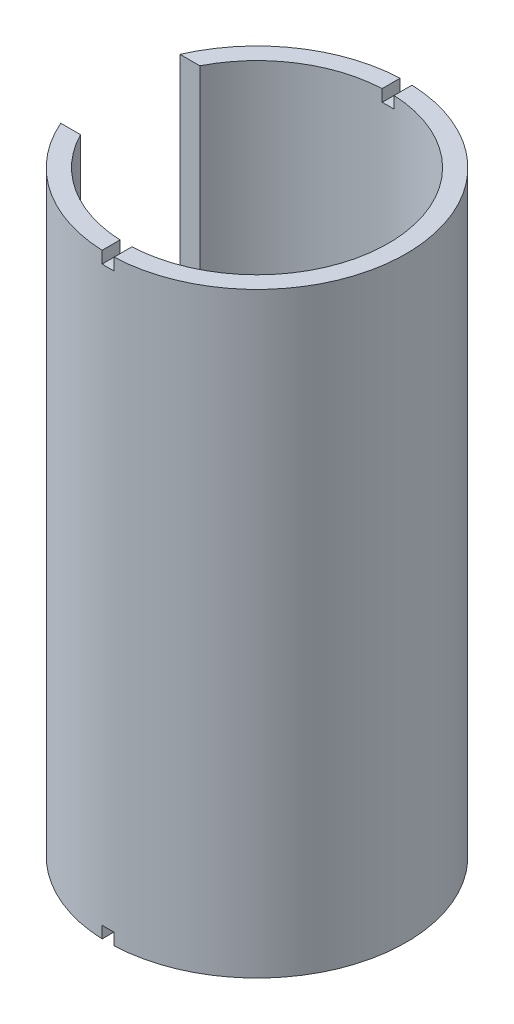
ISO-10303-21;
HEADER;
FILE_DESCRIPTION(('STEP AP214'),'2;1');
FILE_NAME('part.step','',(''),(''),'','','');
FILE_SCHEMA(('AUTOMOTIVE_DESIGN { 1 0 10303 214 1 1 1 1 }'));
ENDSEC;
DATA;
#1=APPLICATION_CONTEXT('core data for automotive mechanical design processes');
#2=APPLICATION_PROTOCOL_DEFINITION('international standard','automotive_design',2000,#1);
#3=PRODUCT_CONTEXT('',#1,'mechanical');
#4=PRODUCT('Part','Part','',(#3));
#5=PRODUCT_RELATED_PRODUCT_CATEGORY('part','',(#4));
#6=PRODUCT_DEFINITION_FORMATION('','',#4);
#7=PRODUCT_DEFINITION_CONTEXT('part definition',#1,'design');
#8=PRODUCT_DEFINITION('design','',#6,#7);
#9=PRODUCT_DEFINITION_SHAPE('','',#8);
#10=(LENGTH_UNIT() NAMED_UNIT(*) SI_UNIT(.MILLI.,.METRE.));
#11=(NAMED_UNIT(*) PLANE_ANGLE_UNIT() SI_UNIT($,.RADIAN.));
#12=(NAMED_UNIT(*) SI_UNIT($,.STERADIAN.) SOLID_ANGLE_UNIT());
#13=UNCERTAINTY_MEASURE_WITH_UNIT(LENGTH_MEASURE(1.E-05),#10,'distance_accuracy_value','');
#14=(GEOMETRIC_REPRESENTATION_CONTEXT(3) GLOBAL_UNCERTAINTY_ASSIGNED_CONTEXT((#13)) GLOBAL_UNIT_ASSIGNED_CONTEXT((#10,
#11,#12)) REPRESENTATION_CONTEXT('',''));
#15=CARTESIAN_POINT('',(0.,0.,0.));
#16=DIRECTION('',(0.,0.,1.));
#17=DIRECTION('',(1.,0.,0.));
#18=AXIS2_PLACEMENT_3D('',#15,#16,#17);
#19=CARTESIAN_POINT('',(0.,100.,0.));
#20=DIRECTION('',(0.,1.,0.));
#21=DIRECTION('',(0.,0.,1.));
#22=AXIS2_PLACEMENT_3D('',#19,#20,#21);
#23=PLANE('',#22);
#24=CARTESIAN_POINT('',(0.,100.,0.));
#25=DIRECTION('',(0.,1.,0.));
#26=DIRECTION('',(0.,0.,1.));
#27=AXIS2_PLACEMENT_3D('',#24,#25,#26);
#28=CIRCLE('',#27,25.);
#29=CARTESIAN_POINT('',(-1.,100.,-24.9799919935936));
#30=VERTEX_POINT('',#29);
#31=CARTESIAN_POINT('',(-22.9128784747792,100.,-10.));
#32=VERTEX_POINT('',#31);
#33=EDGE_CURVE('E181',#30,#32,#28,.T.);
#34=ORIENTED_EDGE('',*,*,#33,.T.);
#35=DIRECTION('',(1.,0.,0.));
#36=VECTOR('',#35,1.);
#37=CARTESIAN_POINT('',(0.,100.,-10.));
#38=LINE('',#37,#36);
#39=CARTESIAN_POINT('',(-19.5959179422654,100.,-10.));
#40=VERTEX_POINT('',#39);
#41=EDGE_CURVE('E167',#32,#40,#38,.T.);
#42=ORIENTED_EDGE('',*,*,#41,.T.);
#43=CARTESIAN_POINT('',(0.,100.,0.));
#44=DIRECTION('',(0.,1.,0.));
#45=DIRECTION('',(0.,0.,1.));
#46=AXIS2_PLACEMENT_3D('',#43,#44,#45);
#47=CIRCLE('',#46,22.);
#48=CARTESIAN_POINT('',(-1.,100.,-21.9772609758359));
#49=VERTEX_POINT('',#48);
#50=EDGE_CURVE('E231',#49,#40,#47,.T.);
#51=ORIENTED_EDGE('',*,*,#50,.F.);
#52=DIRECTION('',(0.,0.,1.));
#53=VECTOR('',#52,1.);
#54=CARTESIAN_POINT('',(-1.,100.,-25.));
#55=LINE('',#54,#53);
#56=EDGE_CURVE('E188',#30,#49,#55,.T.);
#57=ORIENTED_EDGE('',*,*,#56,.F.);
#58=EDGE_LOOP('',(#34,#42,#51,#57));
#59=FACE_BOUND('',#58,.T.);
#60=ADVANCED_FACE('F33',(#59),#23,.T.);
#61=CARTESIAN_POINT('',(0.,0.,0.));
#62=DIRECTION('',(0.,1.,0.));
#63=DIRECTION('',(0.,0.,1.));
#64=AXIS2_PLACEMENT_3D('',#61,#62,#63);
#65=PLANE('',#64);
#66=DIRECTION('',(1.,0.,0.));
#67=VECTOR('',#66,1.);
#68=CARTESIAN_POINT('',(0.,0.,-10.));
#69=LINE('',#68,#67);
#70=CARTESIAN_POINT('',(-22.9128784747792,0.,-10.));
#71=VERTEX_POINT('',#70);
#72=CARTESIAN_POINT('',(-19.5959179422654,0.,-10.));
#73=VERTEX_POINT('',#72);
#74=EDGE_CURVE('E48',#71,#73,#69,.T.);
#75=ORIENTED_EDGE('',*,*,#74,.F.);
#76=CARTESIAN_POINT('',(0.,0.,0.));
#77=DIRECTION('',(0.,1.,0.));
#78=DIRECTION('',(0.,0.,1.));
#79=AXIS2_PLACEMENT_3D('',#76,#77,#78);
#80=CIRCLE('',#79,25.);
#81=CARTESIAN_POINT('',(-1.,0.,-24.9799919935936));
#82=VERTEX_POINT('',#81);
#83=EDGE_CURVE('E184',#82,#71,#80,.T.);
#84=ORIENTED_EDGE('',*,*,#83,.F.);
#85=DIRECTION('',(0.,0.,1.));
#86=VECTOR('',#85,1.);
#87=CARTESIAN_POINT('',(-1.,0.,-25.));
#88=LINE('',#87,#86);
#89=CARTESIAN_POINT('',(-1.,0.,-21.9772609758359));
#90=VERTEX_POINT('',#89);
#91=EDGE_CURVE('E235',#82,#90,#88,.T.);
#92=ORIENTED_EDGE('',*,*,#91,.T.);
#93=CARTESIAN_POINT('',(0.,0.,0.));
#94=DIRECTION('',(0.,1.,0.));
#95=DIRECTION('',(0.,0.,1.));
#96=AXIS2_PLACEMENT_3D('',#93,#94,#95);
#97=CIRCLE('',#96,22.);
#98=EDGE_CURVE('E229',#90,#73,#97,.T.);
#99=ORIENTED_EDGE('',*,*,#98,.T.);
#100=EDGE_LOOP('',(#75,#84,#92,#99));
#101=FACE_BOUND('',#100,.T.);
#102=ADVANCED_FACE('F234',(#101),#65,.F.);
#103=DIRECTION('',(1.,0.,0.));
#104=VECTOR('',#103,1.);
#105=CARTESIAN_POINT('',(0.,100.,10.));
#106=LINE('',#105,#104);
#107=CARTESIAN_POINT('',(-22.9128784747792,100.,10.));
#108=VERTEX_POINT('',#107);
#109=CARTESIAN_POINT('',(-19.5959179422654,100.,10.));
#110=VERTEX_POINT('',#109);
#111=EDGE_CURVE('E55',#108,#110,#106,.T.);
#112=ORIENTED_EDGE('',*,*,#111,.F.);
#113=CARTESIAN_POINT('',(-1.,100.,24.9799919935936));
#114=VERTEX_POINT('',#113);
#115=EDGE_CURVE('E190',#108,#114,#28,.T.);
#116=ORIENTED_EDGE('',*,*,#115,.T.);
#117=CARTESIAN_POINT('',(-1.,100.,21.9772609758359));
#118=VERTEX_POINT('',#117);
#119=EDGE_CURVE('E266',#118,#114,#55,.T.);
#120=ORIENTED_EDGE('',*,*,#119,.F.);
#121=EDGE_CURVE('E238',#110,#118,#47,.T.);
#122=ORIENTED_EDGE('',*,*,#121,.F.);
#123=EDGE_LOOP('',(#112,#116,#120,#122));
#124=FACE_BOUND('',#123,.T.);
#125=ADVANCED_FACE('F269',(#124),#23,.T.);
#126=CARTESIAN_POINT('',(-22.9128784747792,0.,10.));
#127=VERTEX_POINT('',#126);
#128=CARTESIAN_POINT('',(-1.,0.,24.9799919935936));
#129=VERTEX_POINT('',#128);
#130=EDGE_CURVE('E200',#127,#129,#80,.T.);
#131=ORIENTED_EDGE('',*,*,#130,.F.);
#132=DIRECTION('',(1.,0.,0.));
#133=VECTOR('',#132,1.);
#134=CARTESIAN_POINT('',(0.,0.,10.));
#135=LINE('',#134,#133);
#136=CARTESIAN_POINT('',(-19.5959179422654,0.,10.));
#137=VERTEX_POINT('',#136);
#138=EDGE_CURVE('E185',#127,#137,#135,.T.);
#139=ORIENTED_EDGE('',*,*,#138,.T.);
#140=CARTESIAN_POINT('',(-1.,0.,21.9772609758359));
#141=VERTEX_POINT('',#140);
#142=EDGE_CURVE('E236',#137,#141,#97,.T.);
#143=ORIENTED_EDGE('',*,*,#142,.T.);
#144=EDGE_CURVE('E298',#141,#129,#88,.T.);
#145=ORIENTED_EDGE('',*,*,#144,.T.);
#146=EDGE_LOOP('',(#131,#139,#143,#145));
#147=FACE_BOUND('',#146,.T.);
#148=ADVANCED_FACE('F350',(#147),#65,.F.);
#149=DIRECTION('',(0.,0.,1.));
#150=VECTOR('',#149,1.);
#151=CARTESIAN_POINT('',(0.999999999999963,100.,-25.));
#152=LINE('',#151,#150);
#153=CARTESIAN_POINT('',(0.999999999999963,100.,21.9772609758359));
#154=VERTEX_POINT('',#153);
#155=CARTESIAN_POINT('',(0.999999999999963,100.,24.9799919935936));
#156=VERTEX_POINT('',#155);
#157=EDGE_CURVE('E274',#154,#156,#152,.T.);
#158=ORIENTED_EDGE('',*,*,#157,.T.);
#159=CARTESIAN_POINT('',(0.999999999999963,100.,-24.9799919935936));
#160=VERTEX_POINT('',#159);
#161=EDGE_CURVE('E189',#156,#160,#28,.T.);
#162=ORIENTED_EDGE('',*,*,#161,.T.);
#163=CARTESIAN_POINT('',(0.999999999999963,100.,-21.9772609758359));
#164=VERTEX_POINT('',#163);
#165=EDGE_CURVE('E270',#160,#164,#152,.T.);
#166=ORIENTED_EDGE('',*,*,#165,.T.);
#167=EDGE_CURVE('E251',#154,#164,#47,.T.);
#168=ORIENTED_EDGE('',*,*,#167,.F.);
#169=EDGE_LOOP('',(#158,#162,#166,#168));
#170=FACE_BOUND('',#169,.T.);
#171=ADVANCED_FACE('F323',(#170),#23,.T.);
#172=CARTESIAN_POINT('',(1.,0.,24.9799919935936));
#173=VERTEX_POINT('',#172);
#174=CARTESIAN_POINT('',(1.,0.,-24.9799919935936));
#175=VERTEX_POINT('',#174);
#176=EDGE_CURVE('E194',#173,#175,#80,.T.);
#177=ORIENTED_EDGE('',*,*,#176,.F.);
#178=DIRECTION('',(0.,0.,1.));
#179=VECTOR('',#178,1.);
#180=CARTESIAN_POINT('',(1.,0.,-25.));
#181=LINE('',#180,#179);
#182=CARTESIAN_POINT('',(1.,0.,21.9772609758359));
#183=VERTEX_POINT('',#182);
#184=EDGE_CURVE('E296',#183,#173,#181,.T.);
#185=ORIENTED_EDGE('',*,*,#184,.F.);
#186=CARTESIAN_POINT('',(1.,0.,-21.9772609758359));
#187=VERTEX_POINT('',#186);
#188=EDGE_CURVE('E197',#183,#187,#97,.T.);
#189=ORIENTED_EDGE('',*,*,#188,.T.);
#190=EDGE_CURVE('E295',#175,#187,#181,.T.);
#191=ORIENTED_EDGE('',*,*,#190,.F.);
#192=EDGE_LOOP('',(#177,#185,#189,#191));
#193=FACE_BOUND('',#192,.T.);
#194=ADVANCED_FACE('F351',(#193),#65,.F.);
#195=CARTESIAN_POINT('',(0.,100.,0.));
#196=DIRECTION('',(0.,-1.,0.));
#197=DIRECTION('',(0.,0.,-1.));
#198=AXIS2_PLACEMENT_3D('',#195,#196,#197);
#199=CYLINDRICAL_SURFACE('',#198,25.);
#200=ORIENTED_EDGE('',*,*,#115,.F.);
#201=DIRECTION('',(0.,-1.,0.));
#202=VECTOR('',#201,1.);
#203=CARTESIAN_POINT('',(-22.9128784747792,100.,10.));
#204=LINE('',#203,#202);
#205=EDGE_CURVE('E277',#108,#127,#204,.T.);
#206=ORIENTED_EDGE('',*,*,#205,.T.);
#207=ORIENTED_EDGE('',*,*,#130,.T.);
#208=DIRECTION('',(0.,-1.,0.));
#209=VECTOR('',#208,1.);
#210=CARTESIAN_POINT('',(-1.,100.,24.9799919935936));
#211=LINE('',#210,#209);
#212=CARTESIAN_POINT('',(-1.,1.99999999999996,24.9799919935936));
#213=VERTEX_POINT('',#212);
#214=EDGE_CURVE('E308',#129,#213,#211,.F.);
#215=ORIENTED_EDGE('',*,*,#214,.T.);
#216=CARTESIAN_POINT('',(0.,1.99999999999996,0.));
#217=DIRECTION('',(0.,1.,0.));
#218=DIRECTION('',(-1.,0.,0.));
#219=AXIS2_PLACEMENT_3D('',#216,#217,#218);
#220=CIRCLE('',#219,25.);
#221=CARTESIAN_POINT('',(1.,1.99999999999996,24.9799919935936));
#222=VERTEX_POINT('',#221);
#223=EDGE_CURVE('E306',#213,#222,#220,.T.);
#224=ORIENTED_EDGE('',*,*,#223,.T.);
#225=DIRECTION('',(0.,-1.,0.));
#226=VECTOR('',#225,1.);
#227=CARTESIAN_POINT('',(0.999999999999979,100.,24.9799919935936));
#228=LINE('',#227,#226);
#229=EDGE_CURVE('E302',#222,#173,#228,.T.);
#230=ORIENTED_EDGE('',*,*,#229,.T.);
#231=ORIENTED_EDGE('',*,*,#176,.T.);
#232=DIRECTION('',(0.,-1.,0.));
#233=VECTOR('',#232,1.);
#234=CARTESIAN_POINT('',(0.999999999999979,100.,-24.9799919935936));
#235=LINE('',#234,#233);
#236=CARTESIAN_POINT('',(1.,1.99999999999996,-24.9799919935936));
#237=VERTEX_POINT('',#236);
#238=EDGE_CURVE('E272',#175,#237,#235,.F.);
#239=ORIENTED_EDGE('',*,*,#238,.T.);
#240=CARTESIAN_POINT('',(-1.,1.99999999999996,-24.9799919935936));
#241=VERTEX_POINT('',#240);
#242=EDGE_CURVE('E305',#237,#241,#220,.T.);
#243=ORIENTED_EDGE('',*,*,#242,.T.);
#244=DIRECTION('',(0.,-1.,0.));
#245=VECTOR('',#244,1.);
#246=CARTESIAN_POINT('',(-1.,100.,-24.9799919935936));
#247=LINE('',#246,#245);
#248=EDGE_CURVE('E311',#241,#82,#247,.T.);
#249=ORIENTED_EDGE('',*,*,#248,.T.);
#250=ORIENTED_EDGE('',*,*,#83,.T.);
#251=DIRECTION('',(0.,-1.,0.));
#252=VECTOR('',#251,1.);
#253=CARTESIAN_POINT('',(-22.9128784747792,100.,-10.));
#254=LINE('',#253,#252);
#255=EDGE_CURVE('E170',#32,#71,#254,.T.);
#256=ORIENTED_EDGE('',*,*,#255,.F.);
#257=ORIENTED_EDGE('',*,*,#33,.F.);
#258=DIRECTION('',(0.,-1.,0.));
#259=VECTOR('',#258,1.);
#260=CARTESIAN_POINT('',(-1.,100.,-24.9799919935936));
#261=LINE('',#260,#259);
#262=CARTESIAN_POINT('',(-1.,98.,-24.9799919935936));
#263=VERTEX_POINT('',#262);
#264=EDGE_CURVE('E239',#30,#263,#261,.T.);
#265=ORIENTED_EDGE('',*,*,#264,.T.);
#266=CARTESIAN_POINT('',(0.,98.,0.));
#267=DIRECTION('',(0.,-1.,0.));
#268=DIRECTION('',(0.,0.,-1.));
#269=AXIS2_PLACEMENT_3D('',#266,#267,#268);
#270=CIRCLE('',#269,25.);
#271=CARTESIAN_POINT('',(0.999999999999964,98.,-24.9799919935936));
#272=VERTEX_POINT('',#271);
#273=EDGE_CURVE('E313',#263,#272,#270,.T.);
#274=ORIENTED_EDGE('',*,*,#273,.T.);
#275=DIRECTION('',(0.,-1.,0.));
#276=VECTOR('',#275,1.);
#277=CARTESIAN_POINT('',(0.999999999999963,100.,-24.9799919935936));
#278=LINE('',#277,#276);
#279=EDGE_CURVE('E316',#272,#160,#278,.F.);
#280=ORIENTED_EDGE('',*,*,#279,.T.);
#281=ORIENTED_EDGE('',*,*,#161,.F.);
#282=DIRECTION('',(0.,-1.,0.));
#283=VECTOR('',#282,1.);
#284=CARTESIAN_POINT('',(0.999999999999963,100.,24.9799919935936));
#285=LINE('',#284,#283);
#286=CARTESIAN_POINT('',(0.999999999999964,98.,24.9799919935936));
#287=VERTEX_POINT('',#286);
#288=EDGE_CURVE('E248',#156,#287,#285,.T.);
#289=ORIENTED_EDGE('',*,*,#288,.T.);
#290=CARTESIAN_POINT('',(-1.,98.,24.9799919935936));
#291=VERTEX_POINT('',#290);
#292=EDGE_CURVE('E315',#287,#291,#270,.T.);
#293=ORIENTED_EDGE('',*,*,#292,.T.);
#294=DIRECTION('',(0.,-1.,0.));
#295=VECTOR('',#294,1.);
#296=CARTESIAN_POINT('',(-1.,100.,24.9799919935936));
#297=LINE('',#296,#295);
#298=EDGE_CURVE('E245',#291,#114,#297,.F.);
#299=ORIENTED_EDGE('',*,*,#298,.T.);
#300=EDGE_LOOP('',(#200,#206,#207,#215,#224,#230,#231,#239,#243,#249,#250,#256,#257,#265,#274,
#280,#281,#289,#293,#299));
#301=FACE_BOUND('',#300,.T.);
#302=ADVANCED_FACE('F35',(#301),#199,.T.);
#303=CARTESIAN_POINT('',(0.,100.,0.));
#304=DIRECTION('',(0.,-1.,0.));
#305=DIRECTION('',(0.,0.,-1.));
#306=AXIS2_PLACEMENT_3D('',#303,#304,#305);
#307=CYLINDRICAL_SURFACE('',#306,22.);
#308=DIRECTION('',(0.,-1.,0.));
#309=VECTOR('',#308,1.);
#310=CARTESIAN_POINT('',(-19.5959179422654,100.,10.));
#311=LINE('',#310,#309);
#312=EDGE_CURVE('E11',#110,#137,#311,.T.);
#313=ORIENTED_EDGE('',*,*,#312,.F.);
#314=ORIENTED_EDGE('',*,*,#121,.T.);
#315=DIRECTION('',(0.,-1.,0.));
#316=VECTOR('',#315,1.);
#317=CARTESIAN_POINT('',(-1.,100.,21.9772609758359));
#318=LINE('',#317,#316);
#319=CARTESIAN_POINT('',(-1.,98.,21.9772609758359));
#320=VERTEX_POINT('',#319);
#321=EDGE_CURVE('E222',#320,#118,#318,.F.);
#322=ORIENTED_EDGE('',*,*,#321,.F.);
#323=CARTESIAN_POINT('',(0.,98.,0.));
#324=DIRECTION('',(0.,-1.,0.));
#325=DIRECTION('',(0.,0.,-1.));
#326=AXIS2_PLACEMENT_3D('',#323,#324,#325);
#327=CIRCLE('',#326,22.);
#328=CARTESIAN_POINT('',(0.999999999999964,98.,21.9772609758359));
#329=VERTEX_POINT('',#328);
#330=EDGE_CURVE('E214',#329,#320,#327,.T.);
#331=ORIENTED_EDGE('',*,*,#330,.F.);
#332=DIRECTION('',(0.,-1.,0.));
#333=VECTOR('',#332,1.);
#334=CARTESIAN_POINT('',(0.999999999999963,100.,21.9772609758359));
#335=LINE('',#334,#333);
#336=EDGE_CURVE('E219',#154,#329,#335,.T.);
#337=ORIENTED_EDGE('',*,*,#336,.F.);
#338=ORIENTED_EDGE('',*,*,#167,.T.);
#339=DIRECTION('',(0.,-1.,0.));
#340=VECTOR('',#339,1.);
#341=CARTESIAN_POINT('',(0.999999999999963,100.,-21.9772609758359));
#342=LINE('',#341,#340);
#343=CARTESIAN_POINT('',(0.999999999999964,98.,-21.9772609758359));
#344=VERTEX_POINT('',#343);
#345=EDGE_CURVE('E213',#344,#164,#342,.F.);
#346=ORIENTED_EDGE('',*,*,#345,.F.);
#347=CARTESIAN_POINT('',(-1.,98.,-21.9772609758359));
#348=VERTEX_POINT('',#347);
#349=EDGE_CURVE('E211',#348,#344,#327,.T.);
#350=ORIENTED_EDGE('',*,*,#349,.F.);
#351=DIRECTION('',(0.,-1.,0.));
#352=VECTOR('',#351,1.);
#353=CARTESIAN_POINT('',(-1.,100.,-21.9772609758359));
#354=LINE('',#353,#352);
#355=EDGE_CURVE('E216',#49,#348,#354,.T.);
#356=ORIENTED_EDGE('',*,*,#355,.F.);
#357=ORIENTED_EDGE('',*,*,#50,.T.);
#358=DIRECTION('',(0.,-1.,0.));
#359=VECTOR('',#358,1.);
#360=CARTESIAN_POINT('',(-19.5959179422654,100.,-10.));
#361=LINE('',#360,#359);
#362=EDGE_CURVE('E41',#40,#73,#361,.T.);
#363=ORIENTED_EDGE('',*,*,#362,.T.);
#364=ORIENTED_EDGE('',*,*,#98,.F.);
#365=DIRECTION('',(0.,-1.,0.));
#366=VECTOR('',#365,1.);
#367=CARTESIAN_POINT('',(-1.,100.,-21.9772609758359));
#368=LINE('',#367,#366);
#369=CARTESIAN_POINT('',(-1.,1.99999999999996,-21.9772609758359));
#370=VERTEX_POINT('',#369);
#371=EDGE_CURVE('E204',#370,#90,#368,.T.);
#372=ORIENTED_EDGE('',*,*,#371,.F.);
#373=CARTESIAN_POINT('',(0.,1.99999999999996,0.));
#374=DIRECTION('',(0.,1.,0.));
#375=DIRECTION('',(-1.,0.,0.));
#376=AXIS2_PLACEMENT_3D('',#373,#374,#375);
#377=CIRCLE('',#376,22.);
#378=CARTESIAN_POINT('',(1.,1.99999999999996,-21.9772609758359));
#379=VERTEX_POINT('',#378);
#380=EDGE_CURVE('E202',#379,#370,#377,.T.);
#381=ORIENTED_EDGE('',*,*,#380,.F.);
#382=DIRECTION('',(0.,-1.,0.));
#383=VECTOR('',#382,1.);
#384=CARTESIAN_POINT('',(0.999999999999979,100.,-21.9772609758359));
#385=LINE('',#384,#383);
#386=EDGE_CURVE('E193',#187,#379,#385,.F.);
#387=ORIENTED_EDGE('',*,*,#386,.F.);
#388=ORIENTED_EDGE('',*,*,#188,.F.);
#389=DIRECTION('',(0.,-1.,0.));
#390=VECTOR('',#389,1.);
#391=CARTESIAN_POINT('',(0.999999999999979,100.,21.9772609758359));
#392=LINE('',#391,#390);
#393=CARTESIAN_POINT('',(0.999999999999979,1.99999999999996,21.9772609758359));
#394=VERTEX_POINT('',#393);
#395=EDGE_CURVE('E207',#394,#183,#392,.T.);
#396=ORIENTED_EDGE('',*,*,#395,.F.);
#397=CARTESIAN_POINT('',(-1.,1.99999999999996,21.9772609758359));
#398=VERTEX_POINT('',#397);
#399=EDGE_CURVE('E205',#398,#394,#377,.T.);
#400=ORIENTED_EDGE('',*,*,#399,.F.);
#401=DIRECTION('',(0.,-1.,0.));
#402=VECTOR('',#401,1.);
#403=CARTESIAN_POINT('',(-1.,100.,21.9772609758359));
#404=LINE('',#403,#402);
#405=EDGE_CURVE('E209',#141,#398,#404,.F.);
#406=ORIENTED_EDGE('',*,*,#405,.F.);
#407=ORIENTED_EDGE('',*,*,#142,.F.);
#408=EDGE_LOOP('',(#313,#314,#322,#331,#337,#338,#346,#350,#356,#357,#363,#364,#372,#381,#387,
#388,#396,#400,#406,#407));
#409=FACE_BOUND('',#408,.T.);
#410=ADVANCED_FACE('F227',(#409),#307,.F.);
#411=CARTESIAN_POINT('',(1.,0.,-25.));
#412=DIRECTION('',(1.,0.,0.));
#413=DIRECTION('',(0.,1.,0.));
#414=AXIS2_PLACEMENT_3D('',#411,#412,#413);
#415=PLANE('',#414);
#416=ORIENTED_EDGE('',*,*,#190,.T.);
#417=ORIENTED_EDGE('',*,*,#386,.T.);
#418=DIRECTION('',(0.,0.,1.));
#419=VECTOR('',#418,1.);
#420=CARTESIAN_POINT('',(1.,1.99999999999996,-25.));
#421=LINE('',#420,#419);
#422=EDGE_CURVE('E291',#237,#379,#421,.T.);
#423=ORIENTED_EDGE('',*,*,#422,.F.);
#424=ORIENTED_EDGE('',*,*,#238,.F.);
#425=EDGE_LOOP('',(#416,#417,#423,#424));
#426=FACE_BOUND('',#425,.T.);
#427=ADVANCED_FACE('F387',(#426),#415,.F.);
#428=CARTESIAN_POINT('',(-1.,1.99999999999996,-25.));
#429=DIRECTION('',(0.,1.,0.));
#430=DIRECTION('',(-1.,0.,0.));
#431=AXIS2_PLACEMENT_3D('',#428,#429,#430);
#432=PLANE('',#431);
#433=ORIENTED_EDGE('',*,*,#422,.T.);
#434=ORIENTED_EDGE('',*,*,#380,.T.);
#435=DIRECTION('',(0.,0.,1.));
#436=VECTOR('',#435,1.);
#437=CARTESIAN_POINT('',(-1.,1.99999999999996,-25.));
#438=LINE('',#437,#436);
#439=EDGE_CURVE('E287',#241,#370,#438,.T.);
#440=ORIENTED_EDGE('',*,*,#439,.F.);
#441=ORIENTED_EDGE('',*,*,#242,.F.);
#442=EDGE_LOOP('',(#433,#434,#440,#441));
#443=FACE_BOUND('',#442,.T.);
#444=ADVANCED_FACE('F391',(#443),#432,.F.);
#445=CARTESIAN_POINT('',(-1.,0.,-25.));
#446=DIRECTION('',(-1.,0.,0.));
#447=DIRECTION('',(0.,0.,1.));
#448=AXIS2_PLACEMENT_3D('',#445,#446,#447);
#449=PLANE('',#448);
#450=ORIENTED_EDGE('',*,*,#439,.T.);
#451=ORIENTED_EDGE('',*,*,#371,.T.);
#452=ORIENTED_EDGE('',*,*,#91,.F.);
#453=ORIENTED_EDGE('',*,*,#248,.F.);
#454=EDGE_LOOP('',(#450,#451,#452,#453));
#455=FACE_BOUND('',#454,.T.);
#456=ADVANCED_FACE('F395',(#455),#449,.F.);
#457=ORIENTED_EDGE('',*,*,#144,.F.);
#458=ORIENTED_EDGE('',*,*,#405,.T.);
#459=EDGE_CURVE('E288',#398,#213,#438,.T.);
#460=ORIENTED_EDGE('',*,*,#459,.T.);
#461=ORIENTED_EDGE('',*,*,#214,.F.);
#462=EDGE_LOOP('',(#457,#458,#460,#461));
#463=FACE_BOUND('',#462,.T.);
#464=ADVANCED_FACE('F367',(#463),#449,.F.);
#465=ORIENTED_EDGE('',*,*,#459,.F.);
#466=ORIENTED_EDGE('',*,*,#399,.T.);
#467=EDGE_CURVE('E292',#394,#222,#421,.T.);
#468=ORIENTED_EDGE('',*,*,#467,.T.);
#469=ORIENTED_EDGE('',*,*,#223,.F.);
#470=EDGE_LOOP('',(#465,#466,#468,#469));
#471=FACE_BOUND('',#470,.T.);
#472=ADVANCED_FACE('F373',(#471),#432,.F.);
#473=ORIENTED_EDGE('',*,*,#467,.F.);
#474=ORIENTED_EDGE('',*,*,#395,.T.);
#475=ORIENTED_EDGE('',*,*,#184,.T.);
#476=ORIENTED_EDGE('',*,*,#229,.F.);
#477=EDGE_LOOP('',(#473,#474,#475,#476));
#478=FACE_BOUND('',#477,.T.);
#479=ADVANCED_FACE('F379',(#478),#415,.F.);
#480=CARTESIAN_POINT('',(-1.,98.,-25.));
#481=DIRECTION('',(0.,-1.,0.));
#482=DIRECTION('',(0.,0.,-1.));
#483=AXIS2_PLACEMENT_3D('',#480,#481,#482);
#484=PLANE('',#483);
#485=ORIENTED_EDGE('',*,*,#273,.F.);
#486=DIRECTION('',(0.,0.,1.));
#487=VECTOR('',#486,1.);
#488=CARTESIAN_POINT('',(-1.,98.,-25.));
#489=LINE('',#488,#487);
#490=EDGE_CURVE('E285',#263,#348,#489,.T.);
#491=ORIENTED_EDGE('',*,*,#490,.T.);
#492=ORIENTED_EDGE('',*,*,#349,.T.);
#493=DIRECTION('',(0.,0.,1.));
#494=VECTOR('',#493,1.);
#495=CARTESIAN_POINT('',(0.999999999999964,98.,-25.));
#496=LINE('',#495,#494);
#497=EDGE_CURVE('E281',#272,#344,#496,.T.);
#498=ORIENTED_EDGE('',*,*,#497,.F.);
#499=EDGE_LOOP('',(#485,#491,#492,#498));
#500=FACE_BOUND('',#499,.T.);
#501=ADVANCED_FACE('F331',(#500),#484,.F.);
#502=CARTESIAN_POINT('',(0.999999999999963,100.,-25.));
#503=DIRECTION('',(1.,0.,0.));
#504=DIRECTION('',(0.,1.,0.));
#505=AXIS2_PLACEMENT_3D('',#502,#503,#504);
#506=PLANE('',#505);
#507=ORIENTED_EDGE('',*,*,#497,.T.);
#508=ORIENTED_EDGE('',*,*,#345,.T.);
#509=ORIENTED_EDGE('',*,*,#165,.F.);
#510=ORIENTED_EDGE('',*,*,#279,.F.);
#511=EDGE_LOOP('',(#507,#508,#509,#510));
#512=FACE_BOUND('',#511,.T.);
#513=ADVANCED_FACE('F327',(#512),#506,.F.);
#514=CARTESIAN_POINT('',(-1.,100.,-25.));
#515=DIRECTION('',(-1.,0.,0.));
#516=DIRECTION('',(0.,-1.,0.));
#517=AXIS2_PLACEMENT_3D('',#514,#515,#516);
#518=PLANE('',#517);
#519=ORIENTED_EDGE('',*,*,#56,.T.);
#520=ORIENTED_EDGE('',*,*,#355,.T.);
#521=ORIENTED_EDGE('',*,*,#490,.F.);
#522=ORIENTED_EDGE('',*,*,#264,.F.);
#523=EDGE_LOOP('',(#519,#520,#521,#522));
#524=FACE_BOUND('',#523,.T.);
#525=ADVANCED_FACE('F333',(#524),#518,.F.);
#526=EDGE_CURVE('E268',#320,#291,#489,.T.);
#527=ORIENTED_EDGE('',*,*,#526,.F.);
#528=ORIENTED_EDGE('',*,*,#321,.T.);
#529=ORIENTED_EDGE('',*,*,#119,.T.);
#530=ORIENTED_EDGE('',*,*,#298,.F.);
#531=EDGE_LOOP('',(#527,#528,#529,#530));
#532=FACE_BOUND('',#531,.T.);
#533=ADVANCED_FACE('F264',(#532),#518,.F.);
#534=ORIENTED_EDGE('',*,*,#157,.F.);
#535=ORIENTED_EDGE('',*,*,#336,.T.);
#536=EDGE_CURVE('E282',#329,#287,#496,.T.);
#537=ORIENTED_EDGE('',*,*,#536,.T.);
#538=ORIENTED_EDGE('',*,*,#288,.F.);
#539=EDGE_LOOP('',(#534,#535,#537,#538));
#540=FACE_BOUND('',#539,.T.);
#541=ADVANCED_FACE('F321',(#540),#506,.F.);
#542=ORIENTED_EDGE('',*,*,#536,.F.);
#543=ORIENTED_EDGE('',*,*,#330,.T.);
#544=ORIENTED_EDGE('',*,*,#526,.T.);
#545=ORIENTED_EDGE('',*,*,#292,.F.);
#546=EDGE_LOOP('',(#542,#543,#544,#545));
#547=FACE_BOUND('',#546,.T.);
#548=ADVANCED_FACE('F469',(#547),#484,.F.);
#549=CARTESIAN_POINT('',(0.,-1.2E-05,-10.));
#550=DIRECTION('',(0.,0.,1.));
#551=DIRECTION('',(1.,0.,0.));
#552=AXIS2_PLACEMENT_3D('',#549,#550,#551);
#553=PLANE('',#552);
#554=ORIENTED_EDGE('',*,*,#255,.T.);
#555=ORIENTED_EDGE('',*,*,#74,.T.);
#556=ORIENTED_EDGE('',*,*,#362,.F.);
#557=ORIENTED_EDGE('',*,*,#41,.F.);
#558=EDGE_LOOP('',(#554,#555,#556,#557));
#559=FACE_BOUND('',#558,.T.);
#560=ADVANCED_FACE('F169',(#559),#553,.T.);
#561=CARTESIAN_POINT('',(0.,-1.2E-05,10.));
#562=DIRECTION('',(0.,0.,1.));
#563=DIRECTION('',(1.,0.,0.));
#564=AXIS2_PLACEMENT_3D('',#561,#562,#563);
#565=PLANE('',#564);
#566=ORIENTED_EDGE('',*,*,#111,.T.);
#567=ORIENTED_EDGE('',*,*,#312,.T.);
#568=ORIENTED_EDGE('',*,*,#138,.F.);
#569=ORIENTED_EDGE('',*,*,#205,.F.);
#570=EDGE_LOOP('',(#566,#567,#568,#569));
#571=FACE_BOUND('',#570,.T.);
#572=ADVANCED_FACE('F516',(#571),#565,.F.);
#573=CLOSED_SHELL('',(#60,#102,#125,#148,#171,#194,#302,#410,#427,#444,#456,#464,#472,#479,#501,
#513,#525,#533,#541,#548,#560,#572));
#574=MANIFOLD_SOLID_BREP('B2',#573);
#575=ADVANCED_BREP_SHAPE_REPRESENTATION('',(#18,#574),#14);
#576=SHAPE_DEFINITION_REPRESENTATION(#9,#575);
ENDSEC;
END-ISO-10303-21;
